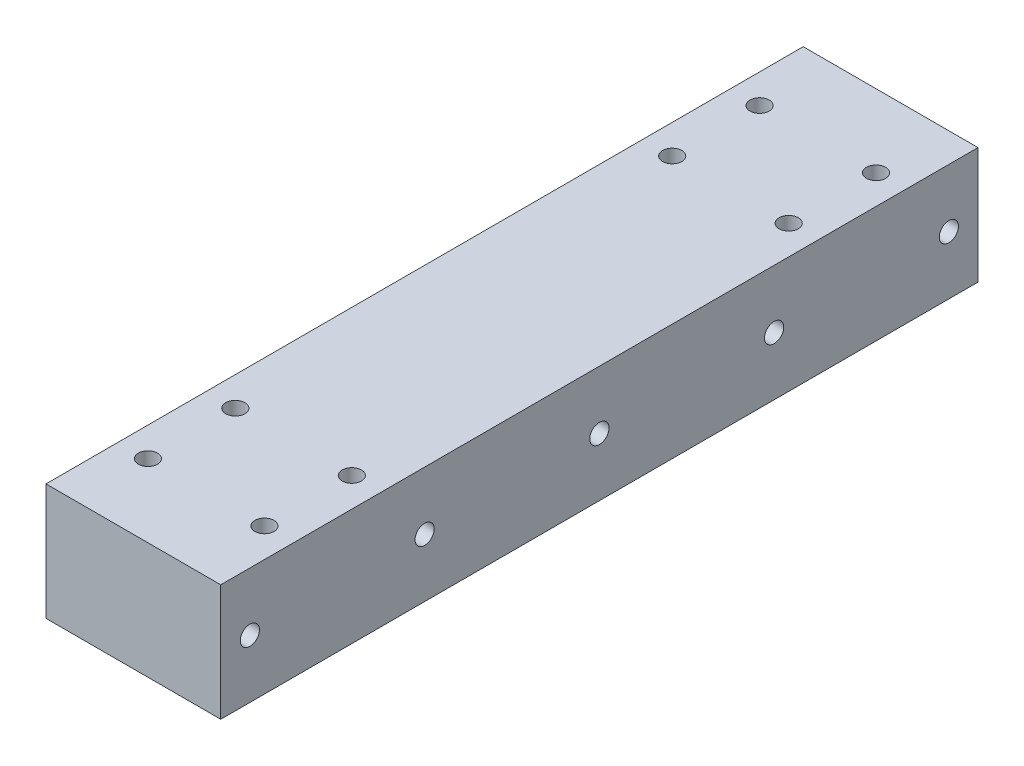
ISO-10303-21;
HEADER;
FILE_DESCRIPTION(('STEP AP214'),'2;1');
FILE_NAME('part.step','',(''),(''),'','','');
FILE_SCHEMA(('AUTOMOTIVE_DESIGN { 1 0 10303 214 1 1 1 1 }'));
ENDSEC;
DATA;
#1=APPLICATION_CONTEXT('core data for automotive mechanical design processes');
#2=APPLICATION_PROTOCOL_DEFINITION('international standard','automotive_design',2000,#1);
#3=PRODUCT_CONTEXT('',#1,'mechanical');
#4=PRODUCT('Part','Part','',(#3));
#5=PRODUCT_RELATED_PRODUCT_CATEGORY('part','',(#4));
#6=PRODUCT_DEFINITION_FORMATION('','',#4);
#7=PRODUCT_DEFINITION_CONTEXT('part definition',#1,'design');
#8=PRODUCT_DEFINITION('design','',#6,#7);
#9=PRODUCT_DEFINITION_SHAPE('','',#8);
#10=(LENGTH_UNIT() NAMED_UNIT(*) SI_UNIT(.MILLI.,.METRE.));
#11=(NAMED_UNIT(*) PLANE_ANGLE_UNIT() SI_UNIT($,.RADIAN.));
#12=(NAMED_UNIT(*) SI_UNIT($,.STERADIAN.) SOLID_ANGLE_UNIT());
#13=UNCERTAINTY_MEASURE_WITH_UNIT(LENGTH_MEASURE(1.E-05),#10,'distance_accuracy_value','');
#14=(GEOMETRIC_REPRESENTATION_CONTEXT(3) GLOBAL_UNCERTAINTY_ASSIGNED_CONTEXT((#13)) GLOBAL_UNIT_ASSIGNED_CONTEXT((#10,
#11,#12)) REPRESENTATION_CONTEXT('',''));
#15=CARTESIAN_POINT('',(0.,0.,0.));
#16=DIRECTION('',(0.,0.,1.));
#17=DIRECTION('',(1.,0.,0.));
#18=AXIS2_PLACEMENT_3D('',#15,#16,#17);
#19=CARTESIAN_POINT('',(0.,0.,130.));
#20=DIRECTION('',(1.,0.,0.));
#21=DIRECTION('',(0.,0.,-1.));
#22=AXIS2_PLACEMENT_3D('',#19,#20,#21);
#23=PLANE('',#22);
#24=CARTESIAN_POINT('',(0.,10.,95.));
#25=DIRECTION('',(1.,0.,0.));
#26=DIRECTION('',(0.,0.,-1.));
#27=AXIS2_PLACEMENT_3D('',#24,#25,#26);
#28=CIRCLE('',#27,1.65);
#29=CARTESIAN_POINT('',(0.,10.,93.35));
#30=VERTEX_POINT('',#29);
#31=EDGE_CURVE('E160',#30,#30,#28,.T.);
#32=ORIENTED_EDGE('',*,*,#31,.T.);
#33=EDGE_LOOP('',(#32));
#34=FACE_BOUND('',#33,.T.);
#35=CARTESIAN_POINT('',(0.,10.,125.));
#36=DIRECTION('',(1.,0.,0.));
#37=DIRECTION('',(0.,0.,-1.));
#38=AXIS2_PLACEMENT_3D('',#35,#36,#37);
#39=CIRCLE('',#38,1.65);
#40=CARTESIAN_POINT('',(0.,10.,123.35));
#41=VERTEX_POINT('',#40);
#42=EDGE_CURVE('E178',#41,#41,#39,.T.);
#43=ORIENTED_EDGE('',*,*,#42,.T.);
#44=EDGE_LOOP('',(#43));
#45=FACE_BOUND('',#44,.T.);
#46=CARTESIAN_POINT('',(0.,10.,5.));
#47=DIRECTION('',(1.,0.,0.));
#48=DIRECTION('',(0.,0.,1.));
#49=AXIS2_PLACEMENT_3D('',#46,#47,#48);
#50=CIRCLE('',#49,1.65);
#51=CARTESIAN_POINT('',(0.,10.,6.65));
#52=VERTEX_POINT('',#51);
#53=EDGE_CURVE('E172',#52,#52,#50,.T.);
#54=ORIENTED_EDGE('',*,*,#53,.T.);
#55=EDGE_LOOP('',(#54));
#56=FACE_BOUND('',#55,.T.);
#57=CARTESIAN_POINT('',(0.,10.,35.));
#58=DIRECTION('',(1.,0.,0.));
#59=DIRECTION('',(0.,0.,1.));
#60=AXIS2_PLACEMENT_3D('',#57,#58,#59);
#61=CIRCLE('',#60,1.65);
#62=CARTESIAN_POINT('',(0.,10.,36.65));
#63=VERTEX_POINT('',#62);
#64=EDGE_CURVE('E166',#63,#63,#61,.T.);
#65=ORIENTED_EDGE('',*,*,#64,.T.);
#66=EDGE_LOOP('',(#65));
#67=FACE_BOUND('',#66,.T.);
#68=CARTESIAN_POINT('',(0.,10.,65.));
#69=DIRECTION('',(1.,0.,0.));
#70=DIRECTION('',(0.,0.,-1.));
#71=AXIS2_PLACEMENT_3D('',#68,#69,#70);
#72=CIRCLE('',#71,1.65);
#73=CARTESIAN_POINT('',(0.,10.,63.35));
#74=VERTEX_POINT('',#73);
#75=EDGE_CURVE('E119',#74,#74,#72,.T.);
#76=ORIENTED_EDGE('',*,*,#75,.T.);
#77=EDGE_LOOP('',(#76));
#78=FACE_BOUND('',#77,.T.);
#79=DIRECTION('',(0.,-1.,0.));
#80=VECTOR('',#79,1.);
#81=CARTESIAN_POINT('',(0.,0.,0.));
#82=LINE('',#81,#80);
#83=CARTESIAN_POINT('',(0.,20.,0.));
#84=VERTEX_POINT('',#83);
#85=CARTESIAN_POINT('',(0.,0.,0.));
#86=VERTEX_POINT('',#85);
#87=EDGE_CURVE('E95',#84,#86,#82,.T.);
#88=ORIENTED_EDGE('',*,*,#87,.T.);
#89=DIRECTION('',(0.,0.,-1.));
#90=VECTOR('',#89,1.);
#91=CARTESIAN_POINT('',(0.,0.,130.));
#92=LINE('',#91,#90);
#93=CARTESIAN_POINT('',(0.,0.,130.));
#94=VERTEX_POINT('',#93);
#95=EDGE_CURVE('E11',#94,#86,#92,.T.);
#96=ORIENTED_EDGE('',*,*,#95,.F.);
#97=DIRECTION('',(0.,-1.,0.));
#98=VECTOR('',#97,1.);
#99=CARTESIAN_POINT('',(0.,0.,130.));
#100=LINE('',#99,#98);
#101=CARTESIAN_POINT('',(0.,20.,130.));
#102=VERTEX_POINT('',#101);
#103=EDGE_CURVE('E83',#102,#94,#100,.T.);
#104=ORIENTED_EDGE('',*,*,#103,.F.);
#105=DIRECTION('',(0.,0.,-1.));
#106=VECTOR('',#105,1.);
#107=CARTESIAN_POINT('',(0.,20.,130.));
#108=LINE('',#107,#106);
#109=EDGE_CURVE('E91',#102,#84,#108,.T.);
#110=ORIENTED_EDGE('',*,*,#109,.T.);
#111=EDGE_LOOP('',(#88,#96,#104,#110));
#112=FACE_BOUND('',#111,.T.);
#113=ADVANCED_FACE('F32',(#34,#45,#56,#67,#78,#112),#23,.F.);
#114=CARTESIAN_POINT('',(0.,0.,130.));
#115=DIRECTION('',(0.,1.,0.));
#116=DIRECTION('',(0.,0.,1.));
#117=AXIS2_PLACEMENT_3D('',#114,#115,#116);
#118=PLANE('',#117);
#119=CARTESIAN_POINT('',(5.,0.,102.5));
#120=DIRECTION('',(0.,1.,0.));
#121=DIRECTION('',(0.,0.,-1.));
#122=AXIS2_PLACEMENT_3D('',#119,#120,#121);
#123=CIRCLE('',#122,1.65);
#124=CARTESIAN_POINT('',(5.,0.,100.85));
#125=VERTEX_POINT('',#124);
#126=EDGE_CURVE('E112',#125,#125,#123,.T.);
#127=ORIENTED_EDGE('',*,*,#126,.T.);
#128=EDGE_LOOP('',(#127));
#129=FACE_BOUND('',#128,.T.);
#130=CARTESIAN_POINT('',(25.,0.,102.5));
#131=DIRECTION('',(0.,1.,0.));
#132=DIRECTION('',(0.,0.,1.));
#133=AXIS2_PLACEMENT_3D('',#130,#131,#132);
#134=CIRCLE('',#133,1.65);
#135=CARTESIAN_POINT('',(25.,0.,104.15));
#136=VERTEX_POINT('',#135);
#137=EDGE_CURVE('E149',#136,#136,#134,.T.);
#138=ORIENTED_EDGE('',*,*,#137,.T.);
#139=EDGE_LOOP('',(#138));
#140=FACE_BOUND('',#139,.T.);
#141=CARTESIAN_POINT('',(25.,0.,117.5));
#142=DIRECTION('',(0.,1.,0.));
#143=DIRECTION('',(0.,0.,-1.));
#144=AXIS2_PLACEMENT_3D('',#141,#142,#143);
#145=CIRCLE('',#144,1.65);
#146=CARTESIAN_POINT('',(25.,0.,115.85));
#147=VERTEX_POINT('',#146);
#148=EDGE_CURVE('E143',#147,#147,#145,.T.);
#149=ORIENTED_EDGE('',*,*,#148,.T.);
#150=EDGE_LOOP('',(#149));
#151=FACE_BOUND('',#150,.T.);
#152=CARTESIAN_POINT('',(25.,0.,12.5));
#153=DIRECTION('',(0.,1.,0.));
#154=DIRECTION('',(0.,0.,1.));
#155=AXIS2_PLACEMENT_3D('',#152,#153,#154);
#156=CIRCLE('',#155,1.65);
#157=CARTESIAN_POINT('',(25.,0.,14.15));
#158=VERTEX_POINT('',#157);
#159=EDGE_CURVE('E137',#158,#158,#156,.T.);
#160=ORIENTED_EDGE('',*,*,#159,.T.);
#161=EDGE_LOOP('',(#160));
#162=FACE_BOUND('',#161,.T.);
#163=CARTESIAN_POINT('',(25.,0.,27.5));
#164=DIRECTION('',(0.,1.,0.));
#165=DIRECTION('',(0.,0.,-1.));
#166=AXIS2_PLACEMENT_3D('',#163,#164,#165);
#167=CIRCLE('',#166,1.65);
#168=CARTESIAN_POINT('',(25.,0.,25.85));
#169=VERTEX_POINT('',#168);
#170=EDGE_CURVE('E131',#169,#169,#167,.T.);
#171=ORIENTED_EDGE('',*,*,#170,.T.);
#172=EDGE_LOOP('',(#171));
#173=FACE_BOUND('',#172,.T.);
#174=CARTESIAN_POINT('',(5.,0.,27.5));
#175=DIRECTION('',(0.,1.,0.));
#176=DIRECTION('',(0.,0.,1.));
#177=AXIS2_PLACEMENT_3D('',#174,#175,#176);
#178=CIRCLE('',#177,1.65);
#179=CARTESIAN_POINT('',(5.,0.,29.15));
#180=VERTEX_POINT('',#179);
#181=EDGE_CURVE('E125',#180,#180,#178,.T.);
#182=ORIENTED_EDGE('',*,*,#181,.T.);
#183=EDGE_LOOP('',(#182));
#184=FACE_BOUND('',#183,.T.);
#185=CARTESIAN_POINT('',(5.,0.,12.5));
#186=DIRECTION('',(0.,1.,0.));
#187=DIRECTION('',(0.,0.,-1.));
#188=AXIS2_PLACEMENT_3D('',#185,#186,#187);
#189=CIRCLE('',#188,1.65);
#190=CARTESIAN_POINT('',(5.,0.,10.85));
#191=VERTEX_POINT('',#190);
#192=EDGE_CURVE('E118',#191,#191,#189,.T.);
#193=ORIENTED_EDGE('',*,*,#192,.T.);
#194=EDGE_LOOP('',(#193));
#195=FACE_BOUND('',#194,.T.);
#196=CARTESIAN_POINT('',(5.,0.,117.5));
#197=DIRECTION('',(0.,1.,0.));
#198=DIRECTION('',(0.,0.,1.));
#199=AXIS2_PLACEMENT_3D('',#196,#197,#198);
#200=CIRCLE('',#199,1.65);
#201=CARTESIAN_POINT('',(5.,0.,119.15));
#202=VERTEX_POINT('',#201);
#203=EDGE_CURVE('E98',#202,#202,#200,.T.);
#204=ORIENTED_EDGE('',*,*,#203,.T.);
#205=EDGE_LOOP('',(#204));
#206=FACE_BOUND('',#205,.T.);
#207=DIRECTION('',(1.,0.,0.));
#208=VECTOR('',#207,1.);
#209=CARTESIAN_POINT('',(0.,0.,0.));
#210=LINE('',#209,#208);
#211=CARTESIAN_POINT('',(30.,0.,0.));
#212=VERTEX_POINT('',#211);
#213=EDGE_CURVE('E87',#86,#212,#210,.T.);
#214=ORIENTED_EDGE('',*,*,#213,.T.);
#215=DIRECTION('',(0.,0.,-1.));
#216=VECTOR('',#215,1.);
#217=CARTESIAN_POINT('',(30.,0.,130.));
#218=LINE('',#217,#216);
#219=CARTESIAN_POINT('',(30.,0.,130.));
#220=VERTEX_POINT('',#219);
#221=EDGE_CURVE('E40',#220,#212,#218,.T.);
#222=ORIENTED_EDGE('',*,*,#221,.F.);
#223=DIRECTION('',(1.,0.,0.));
#224=VECTOR('',#223,1.);
#225=CARTESIAN_POINT('',(0.,0.,130.));
#226=LINE('',#225,#224);
#227=EDGE_CURVE('E78',#94,#220,#226,.T.);
#228=ORIENTED_EDGE('',*,*,#227,.F.);
#229=ORIENTED_EDGE('',*,*,#95,.T.);
#230=EDGE_LOOP('',(#214,#222,#228,#229));
#231=FACE_BOUND('',#230,.T.);
#232=ADVANCED_FACE('F86',(#129,#140,#151,#162,#173,#184,#195,#206,#231),#118,.F.);
#233=CARTESIAN_POINT('',(30.,0.,130.));
#234=DIRECTION('',(-1.,0.,0.));
#235=DIRECTION('',(0.,0.,1.));
#236=AXIS2_PLACEMENT_3D('',#233,#234,#235);
#237=PLANE('',#236);
#238=CARTESIAN_POINT('',(30.,10.,95.));
#239=DIRECTION('',(1.,0.,0.));
#240=DIRECTION('',(0.,0.,-1.));
#241=AXIS2_PLACEMENT_3D('',#238,#239,#240);
#242=CIRCLE('',#241,1.65);
#243=CARTESIAN_POINT('',(30.,10.,93.35));
#244=VERTEX_POINT('',#243);
#245=EDGE_CURVE('E181',#244,#244,#242,.T.);
#246=ORIENTED_EDGE('',*,*,#245,.F.);
#247=EDGE_LOOP('',(#246));
#248=FACE_BOUND('',#247,.T.);
#249=CARTESIAN_POINT('',(30.,10.,125.));
#250=DIRECTION('',(1.,0.,0.));
#251=DIRECTION('',(0.,0.,-1.));
#252=AXIS2_PLACEMENT_3D('',#249,#250,#251);
#253=CIRCLE('',#252,1.65);
#254=CARTESIAN_POINT('',(30.,10.,123.35));
#255=VERTEX_POINT('',#254);
#256=EDGE_CURVE('E175',#255,#255,#253,.T.);
#257=ORIENTED_EDGE('',*,*,#256,.F.);
#258=EDGE_LOOP('',(#257));
#259=FACE_BOUND('',#258,.T.);
#260=CARTESIAN_POINT('',(30.,10.,5.));
#261=DIRECTION('',(1.,0.,0.));
#262=DIRECTION('',(0.,0.,1.));
#263=AXIS2_PLACEMENT_3D('',#260,#261,#262);
#264=CIRCLE('',#263,1.65);
#265=CARTESIAN_POINT('',(30.,10.,6.65));
#266=VERTEX_POINT('',#265);
#267=EDGE_CURVE('E169',#266,#266,#264,.T.);
#268=ORIENTED_EDGE('',*,*,#267,.F.);
#269=EDGE_LOOP('',(#268));
#270=FACE_BOUND('',#269,.T.);
#271=CARTESIAN_POINT('',(30.,10.,35.));
#272=DIRECTION('',(1.,0.,0.));
#273=DIRECTION('',(0.,0.,1.));
#274=AXIS2_PLACEMENT_3D('',#271,#272,#273);
#275=CIRCLE('',#274,1.65);
#276=CARTESIAN_POINT('',(30.,10.,36.65));
#277=VERTEX_POINT('',#276);
#278=EDGE_CURVE('E163',#277,#277,#275,.T.);
#279=ORIENTED_EDGE('',*,*,#278,.F.);
#280=EDGE_LOOP('',(#279));
#281=FACE_BOUND('',#280,.T.);
#282=CARTESIAN_POINT('',(30.,10.,65.));
#283=DIRECTION('',(1.,0.,0.));
#284=DIRECTION('',(0.,0.,-1.));
#285=AXIS2_PLACEMENT_3D('',#282,#283,#284);
#286=CIRCLE('',#285,1.65);
#287=CARTESIAN_POINT('',(30.,10.,63.35));
#288=VERTEX_POINT('',#287);
#289=EDGE_CURVE('E157',#288,#288,#286,.T.);
#290=ORIENTED_EDGE('',*,*,#289,.F.);
#291=EDGE_LOOP('',(#290));
#292=FACE_BOUND('',#291,.T.);
#293=DIRECTION('',(0.,1.,0.));
#294=VECTOR('',#293,1.);
#295=CARTESIAN_POINT('',(30.,0.,0.));
#296=LINE('',#295,#294);
#297=CARTESIAN_POINT('',(30.,20.,0.));
#298=VERTEX_POINT('',#297);
#299=EDGE_CURVE('E65',#212,#298,#296,.T.);
#300=ORIENTED_EDGE('',*,*,#299,.T.);
#301=DIRECTION('',(0.,0.,-1.));
#302=VECTOR('',#301,1.);
#303=CARTESIAN_POINT('',(30.,20.,130.));
#304=LINE('',#303,#302);
#305=CARTESIAN_POINT('',(30.,20.,130.));
#306=VERTEX_POINT('',#305);
#307=EDGE_CURVE('E88',#306,#298,#304,.T.);
#308=ORIENTED_EDGE('',*,*,#307,.F.);
#309=DIRECTION('',(0.,1.,0.));
#310=VECTOR('',#309,1.);
#311=CARTESIAN_POINT('',(30.,0.,130.));
#312=LINE('',#311,#310);
#313=EDGE_CURVE('E81',#220,#306,#312,.T.);
#314=ORIENTED_EDGE('',*,*,#313,.F.);
#315=ORIENTED_EDGE('',*,*,#221,.T.);
#316=EDGE_LOOP('',(#300,#308,#314,#315));
#317=FACE_BOUND('',#316,.T.);
#318=ADVANCED_FACE('F89',(#248,#259,#270,#281,#292,#317),#237,.F.);
#319=CARTESIAN_POINT('',(0.,20.,130.));
#320=DIRECTION('',(0.,-1.,0.));
#321=DIRECTION('',(0.,0.,-1.));
#322=AXIS2_PLACEMENT_3D('',#319,#320,#321);
#323=PLANE('',#322);
#324=CARTESIAN_POINT('',(5.,20.,102.5));
#325=DIRECTION('',(0.,1.,0.));
#326=DIRECTION('',(0.,0.,-1.));
#327=AXIS2_PLACEMENT_3D('',#324,#325,#326);
#328=CIRCLE('',#327,1.65);
#329=CARTESIAN_POINT('',(5.,20.,100.85));
#330=VERTEX_POINT('',#329);
#331=EDGE_CURVE('E152',#330,#330,#328,.T.);
#332=ORIENTED_EDGE('',*,*,#331,.F.);
#333=EDGE_LOOP('',(#332));
#334=FACE_BOUND('',#333,.T.);
#335=CARTESIAN_POINT('',(25.,20.,102.5));
#336=DIRECTION('',(0.,1.,0.));
#337=DIRECTION('',(0.,0.,1.));
#338=AXIS2_PLACEMENT_3D('',#335,#336,#337);
#339=CIRCLE('',#338,1.65);
#340=CARTESIAN_POINT('',(25.,20.,104.15));
#341=VERTEX_POINT('',#340);
#342=EDGE_CURVE('E146',#341,#341,#339,.T.);
#343=ORIENTED_EDGE('',*,*,#342,.F.);
#344=EDGE_LOOP('',(#343));
#345=FACE_BOUND('',#344,.T.);
#346=CARTESIAN_POINT('',(25.,20.,117.5));
#347=DIRECTION('',(0.,1.,0.));
#348=DIRECTION('',(0.,0.,-1.));
#349=AXIS2_PLACEMENT_3D('',#346,#347,#348);
#350=CIRCLE('',#349,1.65);
#351=CARTESIAN_POINT('',(25.,20.,115.85));
#352=VERTEX_POINT('',#351);
#353=EDGE_CURVE('E140',#352,#352,#350,.T.);
#354=ORIENTED_EDGE('',*,*,#353,.F.);
#355=EDGE_LOOP('',(#354));
#356=FACE_BOUND('',#355,.T.);
#357=CARTESIAN_POINT('',(25.,20.,12.5));
#358=DIRECTION('',(0.,1.,0.));
#359=DIRECTION('',(0.,0.,1.));
#360=AXIS2_PLACEMENT_3D('',#357,#358,#359);
#361=CIRCLE('',#360,1.65);
#362=CARTESIAN_POINT('',(25.,20.,14.15));
#363=VERTEX_POINT('',#362);
#364=EDGE_CURVE('E134',#363,#363,#361,.T.);
#365=ORIENTED_EDGE('',*,*,#364,.F.);
#366=EDGE_LOOP('',(#365));
#367=FACE_BOUND('',#366,.T.);
#368=CARTESIAN_POINT('',(25.,20.,27.5));
#369=DIRECTION('',(0.,1.,0.));
#370=DIRECTION('',(0.,0.,-1.));
#371=AXIS2_PLACEMENT_3D('',#368,#369,#370);
#372=CIRCLE('',#371,1.65);
#373=CARTESIAN_POINT('',(25.,20.,25.85));
#374=VERTEX_POINT('',#373);
#375=EDGE_CURVE('E128',#374,#374,#372,.T.);
#376=ORIENTED_EDGE('',*,*,#375,.F.);
#377=EDGE_LOOP('',(#376));
#378=FACE_BOUND('',#377,.T.);
#379=CARTESIAN_POINT('',(5.,20.,27.5));
#380=DIRECTION('',(0.,1.,0.));
#381=DIRECTION('',(0.,0.,1.));
#382=AXIS2_PLACEMENT_3D('',#379,#380,#381);
#383=CIRCLE('',#382,1.65);
#384=CARTESIAN_POINT('',(5.,20.,29.15));
#385=VERTEX_POINT('',#384);
#386=EDGE_CURVE('E122',#385,#385,#383,.T.);
#387=ORIENTED_EDGE('',*,*,#386,.F.);
#388=EDGE_LOOP('',(#387));
#389=FACE_BOUND('',#388,.T.);
#390=CARTESIAN_POINT('',(5.,20.,12.5));
#391=DIRECTION('',(0.,1.,0.));
#392=DIRECTION('',(0.,0.,-1.));
#393=AXIS2_PLACEMENT_3D('',#390,#391,#392);
#394=CIRCLE('',#393,1.65);
#395=CARTESIAN_POINT('',(5.,20.,10.85));
#396=VERTEX_POINT('',#395);
#397=EDGE_CURVE('E115',#396,#396,#394,.T.);
#398=ORIENTED_EDGE('',*,*,#397,.F.);
#399=EDGE_LOOP('',(#398));
#400=FACE_BOUND('',#399,.T.);
#401=CARTESIAN_POINT('',(5.,20.,117.5));
#402=DIRECTION('',(0.,1.,0.));
#403=DIRECTION('',(0.,0.,1.));
#404=AXIS2_PLACEMENT_3D('',#401,#402,#403);
#405=CIRCLE('',#404,1.65);
#406=CARTESIAN_POINT('',(5.,20.,119.15));
#407=VERTEX_POINT('',#406);
#408=EDGE_CURVE('E109',#407,#407,#405,.T.);
#409=ORIENTED_EDGE('',*,*,#408,.F.);
#410=EDGE_LOOP('',(#409));
#411=FACE_BOUND('',#410,.T.);
#412=DIRECTION('',(-1.,0.,0.));
#413=VECTOR('',#412,1.);
#414=CARTESIAN_POINT('',(0.,20.,0.));
#415=LINE('',#414,#413);
#416=EDGE_CURVE('E71',#298,#84,#415,.T.);
#417=ORIENTED_EDGE('',*,*,#416,.T.);
#418=ORIENTED_EDGE('',*,*,#109,.F.);
#419=DIRECTION('',(-1.,0.,0.));
#420=VECTOR('',#419,1.);
#421=CARTESIAN_POINT('',(0.,20.,130.));
#422=LINE('',#421,#420);
#423=EDGE_CURVE('E48',#306,#102,#422,.T.);
#424=ORIENTED_EDGE('',*,*,#423,.F.);
#425=ORIENTED_EDGE('',*,*,#307,.T.);
#426=EDGE_LOOP('',(#417,#418,#424,#425));
#427=FACE_BOUND('',#426,.T.);
#428=ADVANCED_FACE('F103',(#334,#345,#356,#367,#378,#389,#400,#411,#427),#323,.F.);
#429=CARTESIAN_POINT('',(0.,0.,130.));
#430=DIRECTION('',(0.,0.,-1.));
#431=DIRECTION('',(-1.,0.,0.));
#432=AXIS2_PLACEMENT_3D('',#429,#430,#431);
#433=PLANE('',#432);
#434=ORIENTED_EDGE('',*,*,#103,.T.);
#435=ORIENTED_EDGE('',*,*,#227,.T.);
#436=ORIENTED_EDGE('',*,*,#313,.T.);
#437=ORIENTED_EDGE('',*,*,#423,.T.);
#438=EDGE_LOOP('',(#434,#435,#436,#437));
#439=FACE_BOUND('',#438,.T.);
#440=ADVANCED_FACE('F79',(#439),#433,.F.);
#441=CARTESIAN_POINT('',(0.,0.,0.));
#442=DIRECTION('',(0.,0.,-1.));
#443=DIRECTION('',(-1.,0.,0.));
#444=AXIS2_PLACEMENT_3D('',#441,#442,#443);
#445=PLANE('',#444);
#446=ORIENTED_EDGE('',*,*,#87,.F.);
#447=ORIENTED_EDGE('',*,*,#416,.F.);
#448=ORIENTED_EDGE('',*,*,#299,.F.);
#449=ORIENTED_EDGE('',*,*,#213,.F.);
#450=EDGE_LOOP('',(#446,#447,#448,#449));
#451=FACE_BOUND('',#450,.T.);
#452=ADVANCED_FACE('F106',(#451),#445,.T.);
#453=CARTESIAN_POINT('',(5.,0.,117.5));
#454=DIRECTION('',(0.,1.,0.));
#455=DIRECTION('',(0.,0.,1.));
#456=AXIS2_PLACEMENT_3D('',#453,#454,#455);
#457=CYLINDRICAL_SURFACE('',#456,1.65);
#458=ORIENTED_EDGE('',*,*,#203,.F.);
#459=EDGE_LOOP('',(#458));
#460=FACE_BOUND('',#459,.T.);
#461=ORIENTED_EDGE('',*,*,#408,.T.);
#462=EDGE_LOOP('',(#461));
#463=FACE_BOUND('',#462,.T.);
#464=ADVANCED_FACE('F238',(#460,#463),#457,.F.);
#465=CARTESIAN_POINT('',(5.,0.,12.5));
#466=DIRECTION('',(0.,1.,0.));
#467=DIRECTION('',(0.,0.,1.));
#468=AXIS2_PLACEMENT_3D('',#465,#466,#467);
#469=CYLINDRICAL_SURFACE('',#468,1.65);
#470=ORIENTED_EDGE('',*,*,#192,.F.);
#471=EDGE_LOOP('',(#470));
#472=FACE_BOUND('',#471,.T.);
#473=ORIENTED_EDGE('',*,*,#397,.T.);
#474=EDGE_LOOP('',(#473));
#475=FACE_BOUND('',#474,.T.);
#476=ADVANCED_FACE('F243',(#472,#475),#469,.F.);
#477=CARTESIAN_POINT('',(5.,0.,27.5));
#478=DIRECTION('',(0.,1.,0.));
#479=DIRECTION('',(0.,0.,1.));
#480=AXIS2_PLACEMENT_3D('',#477,#478,#479);
#481=CYLINDRICAL_SURFACE('',#480,1.65);
#482=ORIENTED_EDGE('',*,*,#181,.F.);
#483=EDGE_LOOP('',(#482));
#484=FACE_BOUND('',#483,.T.);
#485=ORIENTED_EDGE('',*,*,#386,.T.);
#486=EDGE_LOOP('',(#485));
#487=FACE_BOUND('',#486,.T.);
#488=ADVANCED_FACE('F247',(#484,#487),#481,.F.);
#489=CARTESIAN_POINT('',(25.,0.,27.5));
#490=DIRECTION('',(0.,1.,0.));
#491=DIRECTION('',(0.,0.,1.));
#492=AXIS2_PLACEMENT_3D('',#489,#490,#491);
#493=CYLINDRICAL_SURFACE('',#492,1.65);
#494=ORIENTED_EDGE('',*,*,#170,.F.);
#495=EDGE_LOOP('',(#494));
#496=FACE_BOUND('',#495,.T.);
#497=ORIENTED_EDGE('',*,*,#375,.T.);
#498=EDGE_LOOP('',(#497));
#499=FACE_BOUND('',#498,.T.);
#500=ADVANCED_FACE('F251',(#496,#499),#493,.F.);
#501=CARTESIAN_POINT('',(25.,0.,12.5));
#502=DIRECTION('',(0.,1.,0.));
#503=DIRECTION('',(0.,0.,1.));
#504=AXIS2_PLACEMENT_3D('',#501,#502,#503);
#505=CYLINDRICAL_SURFACE('',#504,1.65);
#506=ORIENTED_EDGE('',*,*,#159,.F.);
#507=EDGE_LOOP('',(#506));
#508=FACE_BOUND('',#507,.T.);
#509=ORIENTED_EDGE('',*,*,#364,.T.);
#510=EDGE_LOOP('',(#509));
#511=FACE_BOUND('',#510,.T.);
#512=ADVANCED_FACE('F255',(#508,#511),#505,.F.);
#513=CARTESIAN_POINT('',(25.,0.,117.5));
#514=DIRECTION('',(0.,1.,0.));
#515=DIRECTION('',(0.,0.,1.));
#516=AXIS2_PLACEMENT_3D('',#513,#514,#515);
#517=CYLINDRICAL_SURFACE('',#516,1.65);
#518=ORIENTED_EDGE('',*,*,#148,.F.);
#519=EDGE_LOOP('',(#518));
#520=FACE_BOUND('',#519,.T.);
#521=ORIENTED_EDGE('',*,*,#353,.T.);
#522=EDGE_LOOP('',(#521));
#523=FACE_BOUND('',#522,.T.);
#524=ADVANCED_FACE('F259',(#520,#523),#517,.F.);
#525=CARTESIAN_POINT('',(25.,0.,102.5));
#526=DIRECTION('',(0.,1.,0.));
#527=DIRECTION('',(0.,0.,1.));
#528=AXIS2_PLACEMENT_3D('',#525,#526,#527);
#529=CYLINDRICAL_SURFACE('',#528,1.65);
#530=ORIENTED_EDGE('',*,*,#137,.F.);
#531=EDGE_LOOP('',(#530));
#532=FACE_BOUND('',#531,.T.);
#533=ORIENTED_EDGE('',*,*,#342,.T.);
#534=EDGE_LOOP('',(#533));
#535=FACE_BOUND('',#534,.T.);
#536=ADVANCED_FACE('F220',(#532,#535),#529,.F.);
#537=CARTESIAN_POINT('',(5.,0.,102.5));
#538=DIRECTION('',(0.,1.,0.));
#539=DIRECTION('',(0.,0.,1.));
#540=AXIS2_PLACEMENT_3D('',#537,#538,#539);
#541=CYLINDRICAL_SURFACE('',#540,1.65);
#542=ORIENTED_EDGE('',*,*,#126,.F.);
#543=EDGE_LOOP('',(#542));
#544=FACE_BOUND('',#543,.T.);
#545=ORIENTED_EDGE('',*,*,#331,.T.);
#546=EDGE_LOOP('',(#545));
#547=FACE_BOUND('',#546,.T.);
#548=ADVANCED_FACE('F210',(#544,#547),#541,.F.);
#549=CARTESIAN_POINT('',(0.,10.,65.));
#550=DIRECTION('',(1.,0.,0.));
#551=DIRECTION('',(0.,0.,-1.));
#552=AXIS2_PLACEMENT_3D('',#549,#550,#551);
#553=CYLINDRICAL_SURFACE('',#552,1.65);
#554=ORIENTED_EDGE('',*,*,#75,.F.);
#555=EDGE_LOOP('',(#554));
#556=FACE_BOUND('',#555,.T.);
#557=ORIENTED_EDGE('',*,*,#289,.T.);
#558=EDGE_LOOP('',(#557));
#559=FACE_BOUND('',#558,.T.);
#560=ADVANCED_FACE('F207',(#556,#559),#553,.F.);
#561=CARTESIAN_POINT('',(0.,10.,35.));
#562=DIRECTION('',(1.,0.,0.));
#563=DIRECTION('',(0.,0.,-1.));
#564=AXIS2_PLACEMENT_3D('',#561,#562,#563);
#565=CYLINDRICAL_SURFACE('',#564,1.65);
#566=ORIENTED_EDGE('',*,*,#64,.F.);
#567=EDGE_LOOP('',(#566));
#568=FACE_BOUND('',#567,.T.);
#569=ORIENTED_EDGE('',*,*,#278,.T.);
#570=EDGE_LOOP('',(#569));
#571=FACE_BOUND('',#570,.T.);
#572=ADVANCED_FACE('F209',(#568,#571),#565,.F.);
#573=CARTESIAN_POINT('',(0.,10.,5.));
#574=DIRECTION('',(1.,0.,0.));
#575=DIRECTION('',(0.,0.,-1.));
#576=AXIS2_PLACEMENT_3D('',#573,#574,#575);
#577=CYLINDRICAL_SURFACE('',#576,1.65);
#578=ORIENTED_EDGE('',*,*,#53,.F.);
#579=EDGE_LOOP('',(#578));
#580=FACE_BOUND('',#579,.T.);
#581=ORIENTED_EDGE('',*,*,#267,.T.);
#582=EDGE_LOOP('',(#581));
#583=FACE_BOUND('',#582,.T.);
#584=ADVANCED_FACE('F217',(#580,#583),#577,.F.);
#585=CARTESIAN_POINT('',(0.,10.,125.));
#586=DIRECTION('',(1.,0.,0.));
#587=DIRECTION('',(0.,0.,-1.));
#588=AXIS2_PLACEMENT_3D('',#585,#586,#587);
#589=CYLINDRICAL_SURFACE('',#588,1.65);
#590=ORIENTED_EDGE('',*,*,#42,.F.);
#591=EDGE_LOOP('',(#590));
#592=FACE_BOUND('',#591,.T.);
#593=ORIENTED_EDGE('',*,*,#256,.T.);
#594=EDGE_LOOP('',(#593));
#595=FACE_BOUND('',#594,.T.);
#596=ADVANCED_FACE('F192',(#592,#595),#589,.F.);
#597=CARTESIAN_POINT('',(0.,10.,95.));
#598=DIRECTION('',(1.,0.,0.));
#599=DIRECTION('',(0.,0.,-1.));
#600=AXIS2_PLACEMENT_3D('',#597,#598,#599);
#601=CYLINDRICAL_SURFACE('',#600,1.65);
#602=ORIENTED_EDGE('',*,*,#31,.F.);
#603=EDGE_LOOP('',(#602));
#604=FACE_BOUND('',#603,.T.);
#605=ORIENTED_EDGE('',*,*,#245,.T.);
#606=EDGE_LOOP('',(#605));
#607=FACE_BOUND('',#606,.T.);
#608=ADVANCED_FACE('F189',(#604,#607),#601,.F.);
#609=CLOSED_SHELL('',(#113,#232,#318,#428,#440,#452,#464,#476,#488,#500,#512,#524,#536,#548,
#560,#572,#584,#596,#608));
#610=MANIFOLD_SOLID_BREP('B2',#609);
#611=ADVANCED_BREP_SHAPE_REPRESENTATION('',(#18,#610),#14);
#612=SHAPE_DEFINITION_REPRESENTATION(#9,#611);
ENDSEC;
END-ISO-10303-21;
